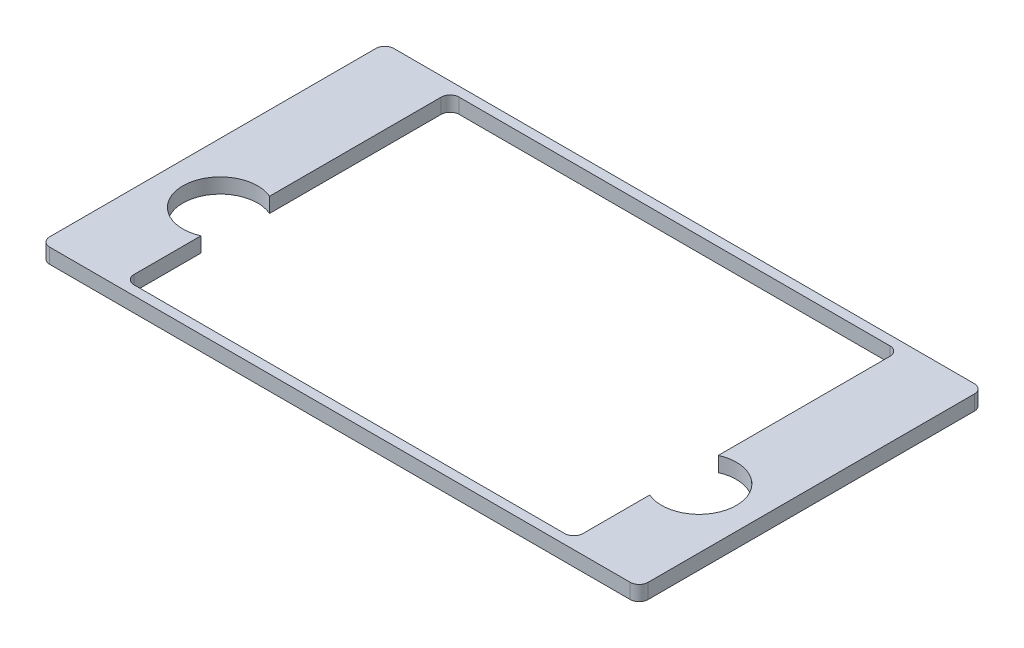
ISO-10303-21;
HEADER;
FILE_DESCRIPTION(('STEP AP214'),'2;1');
FILE_NAME('part.step','',(''),(''),'','','');
FILE_SCHEMA(('AUTOMOTIVE_DESIGN { 1 0 10303 214 1 1 1 1 }'));
ENDSEC;
DATA;
#1=APPLICATION_CONTEXT('core data for automotive mechanical design processes');
#2=APPLICATION_PROTOCOL_DEFINITION('international standard','automotive_design',2000,#1);
#3=PRODUCT_CONTEXT('',#1,'mechanical');
#4=PRODUCT('Part','Part','',(#3));
#5=PRODUCT_RELATED_PRODUCT_CATEGORY('part','',(#4));
#6=PRODUCT_DEFINITION_FORMATION('','',#4);
#7=PRODUCT_DEFINITION_CONTEXT('part definition',#1,'design');
#8=PRODUCT_DEFINITION('design','',#6,#7);
#9=PRODUCT_DEFINITION_SHAPE('','',#8);
#10=(LENGTH_UNIT() NAMED_UNIT(*) SI_UNIT(.MILLI.,.METRE.));
#11=(NAMED_UNIT(*) PLANE_ANGLE_UNIT() SI_UNIT($,.RADIAN.));
#12=(NAMED_UNIT(*) SI_UNIT($,.STERADIAN.) SOLID_ANGLE_UNIT());
#13=UNCERTAINTY_MEASURE_WITH_UNIT(LENGTH_MEASURE(1.E-05),#10,'distance_accuracy_value','');
#14=(GEOMETRIC_REPRESENTATION_CONTEXT(3) GLOBAL_UNCERTAINTY_ASSIGNED_CONTEXT((#13)) GLOBAL_UNIT_ASSIGNED_CONTEXT((#10,
#11,#12)) REPRESENTATION_CONTEXT('',''));
#15=CARTESIAN_POINT('',(0.,0.,0.));
#16=DIRECTION('',(0.,0.,1.));
#17=DIRECTION('',(1.,0.,0.));
#18=AXIS2_PLACEMENT_3D('',#15,#16,#17);
#19=CARTESIAN_POINT('',(222.25,6.35,-138.215));
#20=DIRECTION('',(-1.,0.,0.));
#21=DIRECTION('',(0.,0.,1.));
#22=AXIS2_PLACEMENT_3D('',#19,#20,#21);
#23=PLANE('',#22);
#24=DIRECTION('',(0.,1.,0.));
#25=VECTOR('',#24,1.);
#26=CARTESIAN_POINT('',(222.25,0.,-36.2503221685152));
#27=LINE('',#26,#25);
#28=CARTESIAN_POINT('',(222.25,0.,-36.2503221685152));
#29=VERTEX_POINT('',#28);
#30=CARTESIAN_POINT('',(222.25,6.35,-36.2503221685152));
#31=VERTEX_POINT('',#30);
#32=EDGE_CURVE('E11',#29,#31,#27,.T.);
#33=ORIENTED_EDGE('',*,*,#32,.F.);
#34=DIRECTION('',(0.,0.,-1.));
#35=VECTOR('',#34,1.);
#36=CARTESIAN_POINT('',(222.25,0.,-138.215));
#37=LINE('',#36,#35);
#38=CARTESIAN_POINT('',(222.25,0.,-7.835));
#39=VERTEX_POINT('',#38);
#40=EDGE_CURVE('E214',#39,#29,#37,.T.);
#41=ORIENTED_EDGE('',*,*,#40,.F.);
#42=DIRECTION('',(0.,-1.,0.));
#43=VECTOR('',#42,1.);
#44=CARTESIAN_POINT('',(222.25,6.35,-7.835));
#45=LINE('',#44,#43);
#46=CARTESIAN_POINT('',(222.25,6.35,-7.835));
#47=VERTEX_POINT('',#46);
#48=EDGE_CURVE('E238',#47,#39,#45,.T.);
#49=ORIENTED_EDGE('',*,*,#48,.F.);
#50=DIRECTION('',(0.,0.,-1.));
#51=VECTOR('',#50,1.);
#52=CARTESIAN_POINT('',(222.25,6.35,-138.215));
#53=LINE('',#52,#51);
#54=EDGE_CURVE('E348',#47,#31,#53,.T.);
#55=ORIENTED_EDGE('',*,*,#54,.T.);
#56=EDGE_LOOP('',(#33,#41,#49,#55));
#57=FACE_BOUND('',#56,.T.);
#58=ADVANCED_FACE('F38',(#57),#23,.T.);
#59=CARTESIAN_POINT('',(31.7500000000001,6.35,-138.215));
#60=DIRECTION('',(1.,0.,0.));
#61=DIRECTION('',(0.,0.,-1.));
#62=AXIS2_PLACEMENT_3D('',#59,#60,#61);
#63=PLANE('',#62);
#64=DIRECTION('',(0.,1.,0.));
#65=VECTOR('',#64,1.);
#66=CARTESIAN_POINT('',(31.7500000000001,0.,-65.3496778314848));
#67=LINE('',#66,#65);
#68=CARTESIAN_POINT('',(31.7500000000001,0.,-65.3496778314848));
#69=VERTEX_POINT('',#68);
#70=CARTESIAN_POINT('',(31.7500000000001,6.35,-65.3496778314848));
#71=VERTEX_POINT('',#70);
#72=EDGE_CURVE('E172',#69,#71,#67,.T.);
#73=ORIENTED_EDGE('',*,*,#72,.F.);
#74=DIRECTION('',(0.,0.,1.));
#75=VECTOR('',#74,1.);
#76=CARTESIAN_POINT('',(31.7500000000001,0.,-138.215));
#77=LINE('',#76,#75);
#78=CARTESIAN_POINT('',(31.7500000000001,0.,-138.215));
#79=VERTEX_POINT('',#78);
#80=EDGE_CURVE('E227',#79,#69,#77,.T.);
#81=ORIENTED_EDGE('',*,*,#80,.F.);
#82=DIRECTION('',(0.,-1.,0.));
#83=VECTOR('',#82,1.);
#84=CARTESIAN_POINT('',(31.7500000000001,6.35,-138.215));
#85=LINE('',#84,#83);
#86=CARTESIAN_POINT('',(31.7500000000001,6.35,-138.215));
#87=VERTEX_POINT('',#86);
#88=EDGE_CURVE('E194',#87,#79,#85,.T.);
#89=ORIENTED_EDGE('',*,*,#88,.F.);
#90=DIRECTION('',(0.,0.,1.));
#91=VECTOR('',#90,1.);
#92=CARTESIAN_POINT('',(31.7500000000001,6.35,-138.215));
#93=LINE('',#92,#91);
#94=EDGE_CURVE('E188',#87,#71,#93,.T.);
#95=ORIENTED_EDGE('',*,*,#94,.T.);
#96=EDGE_LOOP('',(#73,#81,#89,#95));
#97=FACE_BOUND('',#96,.T.);
#98=ADVANCED_FACE('F193',(#97),#63,.T.);
#99=CARTESIAN_POINT('',(250.19,6.35,-3.81));
#100=DIRECTION('',(0.,1.,0.));
#101=DIRECTION('',(0.,0.,1.));
#102=AXIS2_PLACEMENT_3D('',#99,#100,#101);
#103=PLANE('',#102);
#104=CARTESIAN_POINT('',(25.4,6.35,-50.8));
#105=DIRECTION('',(0.,1.,0.));
#106=DIRECTION('',(0.,0.,1.));
#107=AXIS2_PLACEMENT_3D('',#104,#105,#106);
#108=CIRCLE('',#107,15.875);
#109=CARTESIAN_POINT('',(31.7500000000001,6.35,-36.2503221685152));
#110=VERTEX_POINT('',#109);
#111=EDGE_CURVE('E60',#71,#110,#108,.T.);
#112=ORIENTED_EDGE('',*,*,#111,.F.);
#113=ORIENTED_EDGE('',*,*,#94,.F.);
#114=CARTESIAN_POINT('',(35.5600000000001,6.35,-138.215));
#115=DIRECTION('',(0.,1.,0.));
#116=DIRECTION('',(0.,0.,1.));
#117=AXIS2_PLACEMENT_3D('',#114,#115,#116);
#118=CIRCLE('',#117,3.81);
#119=CARTESIAN_POINT('',(35.5600000000001,6.35,-142.025));
#120=VERTEX_POINT('',#119);
#121=EDGE_CURVE('E200',#120,#87,#118,.T.);
#122=ORIENTED_EDGE('',*,*,#121,.F.);
#123=DIRECTION('',(-1.,0.,0.));
#124=VECTOR('',#123,1.);
#125=CARTESIAN_POINT('',(35.5600000000001,6.35,-142.025));
#126=LINE('',#125,#124);
#127=CARTESIAN_POINT('',(218.44,6.35,-142.025));
#128=VERTEX_POINT('',#127);
#129=EDGE_CURVE('E327',#128,#120,#126,.T.);
#130=ORIENTED_EDGE('',*,*,#129,.F.);
#131=CARTESIAN_POINT('',(218.44,6.35,-138.215));
#132=DIRECTION('',(0.,1.,0.));
#133=DIRECTION('',(0.,0.,-1.));
#134=AXIS2_PLACEMENT_3D('',#131,#132,#133);
#135=CIRCLE('',#134,3.81000000000001);
#136=CARTESIAN_POINT('',(222.25,6.35,-138.215));
#137=VERTEX_POINT('',#136);
#138=EDGE_CURVE('E351',#137,#128,#135,.T.);
#139=ORIENTED_EDGE('',*,*,#138,.F.);
#140=CARTESIAN_POINT('',(222.25,6.35,-65.3496778314848));
#141=VERTEX_POINT('',#140);
#142=EDGE_CURVE('E316',#141,#137,#53,.T.);
#143=ORIENTED_EDGE('',*,*,#142,.F.);
#144=CARTESIAN_POINT('',(228.6,6.35,-50.8));
#145=DIRECTION('',(0.,1.,0.));
#146=DIRECTION('',(0.,0.,1.));
#147=AXIS2_PLACEMENT_3D('',#144,#145,#146);
#148=CIRCLE('',#147,15.875);
#149=EDGE_CURVE('E52',#31,#141,#148,.T.);
#150=ORIENTED_EDGE('',*,*,#149,.F.);
#151=ORIENTED_EDGE('',*,*,#54,.F.);
#152=CARTESIAN_POINT('',(218.44,6.35,-7.835));
#153=DIRECTION('',(0.,1.,0.));
#154=DIRECTION('',(0.,0.,1.));
#155=AXIS2_PLACEMENT_3D('',#152,#153,#154);
#156=CIRCLE('',#155,3.81000000000002);
#157=CARTESIAN_POINT('',(218.44,6.35,-4.02499999999998));
#158=VERTEX_POINT('',#157);
#159=EDGE_CURVE('E343',#158,#47,#156,.T.);
#160=ORIENTED_EDGE('',*,*,#159,.F.);
#161=DIRECTION('',(1.,0.,0.));
#162=VECTOR('',#161,1.);
#163=CARTESIAN_POINT('',(35.5600000000001,6.35,-4.025));
#164=LINE('',#163,#162);
#165=CARTESIAN_POINT('',(35.5600000000001,6.35,-4.025));
#166=VERTEX_POINT('',#165);
#167=EDGE_CURVE('E341',#166,#158,#164,.T.);
#168=ORIENTED_EDGE('',*,*,#167,.F.);
#169=CARTESIAN_POINT('',(35.5600000000001,6.35,-7.835));
#170=DIRECTION('',(0.,1.,0.));
#171=DIRECTION('',(0.,0.,1.));
#172=AXIS2_PLACEMENT_3D('',#169,#170,#171);
#173=CIRCLE('',#172,3.81);
#174=CARTESIAN_POINT('',(31.7500000000001,6.35,-7.835));
#175=VERTEX_POINT('',#174);
#176=EDGE_CURVE('E228',#175,#166,#173,.T.);
#177=ORIENTED_EDGE('',*,*,#176,.F.);
#178=EDGE_CURVE('E190',#110,#175,#93,.T.);
#179=ORIENTED_EDGE('',*,*,#178,.F.);
#180=EDGE_LOOP('',(#112,#113,#122,#130,#139,#143,#150,#151,#160,#168,#177,#179));
#181=FACE_BOUND('',#180,.T.);
#182=CARTESIAN_POINT('',(250.19,6.35,-3.81));
#183=DIRECTION('',(0.,1.,0.));
#184=DIRECTION('',(0.,0.,1.));
#185=AXIS2_PLACEMENT_3D('',#182,#183,#184);
#186=CIRCLE('',#185,3.80999999999999);
#187=CARTESIAN_POINT('',(250.19,6.35,0.));
#188=VERTEX_POINT('',#187);
#189=CARTESIAN_POINT('',(254.,6.35,-3.81));
#190=VERTEX_POINT('',#189);
#191=EDGE_CURVE('E246',#188,#190,#186,.T.);
#192=ORIENTED_EDGE('',*,*,#191,.T.);
#193=DIRECTION('',(0.,0.,-1.));
#194=VECTOR('',#193,1.);
#195=CARTESIAN_POINT('',(254.,6.35,-3.81));
#196=LINE('',#195,#194);
#197=CARTESIAN_POINT('',(254.,6.35,-142.24));
#198=VERTEX_POINT('',#197);
#199=EDGE_CURVE('E249',#190,#198,#196,.T.);
#200=ORIENTED_EDGE('',*,*,#199,.T.);
#201=CARTESIAN_POINT('',(250.19,6.35,-142.24));
#202=DIRECTION('',(0.,1.,0.));
#203=DIRECTION('',(0.,0.,-1.));
#204=AXIS2_PLACEMENT_3D('',#201,#202,#203);
#205=CIRCLE('',#204,3.81000000000002);
#206=CARTESIAN_POINT('',(250.19,6.35,-146.05));
#207=VERTEX_POINT('',#206);
#208=EDGE_CURVE('E252',#198,#207,#205,.T.);
#209=ORIENTED_EDGE('',*,*,#208,.T.);
#210=DIRECTION('',(-1.,0.,0.));
#211=VECTOR('',#210,1.);
#212=CARTESIAN_POINT('',(3.81,6.35,-146.05));
#213=LINE('',#212,#211);
#214=CARTESIAN_POINT('',(3.81,6.35,-146.05));
#215=VERTEX_POINT('',#214);
#216=EDGE_CURVE('E254',#207,#215,#213,.T.);
#217=ORIENTED_EDGE('',*,*,#216,.T.);
#218=CARTESIAN_POINT('',(3.81,6.35,-142.24));
#219=DIRECTION('',(0.,1.,0.));
#220=DIRECTION('',(0.,0.,-1.));
#221=AXIS2_PLACEMENT_3D('',#218,#219,#220);
#222=CIRCLE('',#221,3.81);
#223=CARTESIAN_POINT('',(0.,6.35,-142.24));
#224=VERTEX_POINT('',#223);
#225=EDGE_CURVE('E256',#215,#224,#222,.T.);
#226=ORIENTED_EDGE('',*,*,#225,.T.);
#227=DIRECTION('',(0.,0.,1.));
#228=VECTOR('',#227,1.);
#229=CARTESIAN_POINT('',(0.,6.35,-3.81000000000003));
#230=LINE('',#229,#228);
#231=CARTESIAN_POINT('',(0.,6.35,-3.81000000000003));
#232=VERTEX_POINT('',#231);
#233=EDGE_CURVE('E258',#224,#232,#230,.T.);
#234=ORIENTED_EDGE('',*,*,#233,.T.);
#235=CARTESIAN_POINT('',(3.81,6.35,-3.81));
#236=DIRECTION('',(0.,1.,0.));
#237=DIRECTION('',(0.,0.,-1.));
#238=AXIS2_PLACEMENT_3D('',#235,#236,#237);
#239=CIRCLE('',#238,3.81);
#240=CARTESIAN_POINT('',(3.81000000000003,6.35,0.));
#241=VERTEX_POINT('',#240);
#242=EDGE_CURVE('E260',#232,#241,#239,.T.);
#243=ORIENTED_EDGE('',*,*,#242,.T.);
#244=DIRECTION('',(1.,0.,0.));
#245=VECTOR('',#244,1.);
#246=CARTESIAN_POINT('',(3.81000000000003,6.35,0.));
#247=LINE('',#246,#245);
#248=EDGE_CURVE('E262',#241,#188,#247,.T.);
#249=ORIENTED_EDGE('',*,*,#248,.T.);
#250=EDGE_LOOP('',(#192,#200,#209,#217,#226,#234,#243,#249));
#251=FACE_BOUND('',#250,.T.);
#252=ADVANCED_FACE('F185',(#181,#251),#103,.T.);
#253=CARTESIAN_POINT('',(250.19,0.,-3.81));
#254=DIRECTION('',(0.,1.,0.));
#255=DIRECTION('',(0.,0.,1.));
#256=AXIS2_PLACEMENT_3D('',#253,#254,#255);
#257=PLANE('',#256);
#258=CARTESIAN_POINT('',(250.19,0.,-3.81));
#259=DIRECTION('',(0.,1.,0.));
#260=DIRECTION('',(0.,0.,1.));
#261=AXIS2_PLACEMENT_3D('',#258,#259,#260);
#262=CIRCLE('',#261,3.80999999999999);
#263=CARTESIAN_POINT('',(250.19,0.,0.));
#264=VERTEX_POINT('',#263);
#265=CARTESIAN_POINT('',(254.,0.,-3.81));
#266=VERTEX_POINT('',#265);
#267=EDGE_CURVE('E245',#264,#266,#262,.T.);
#268=ORIENTED_EDGE('',*,*,#267,.F.);
#269=DIRECTION('',(1.,0.,0.));
#270=VECTOR('',#269,1.);
#271=CARTESIAN_POINT('',(3.81000000000003,0.,0.));
#272=LINE('',#271,#270);
#273=CARTESIAN_POINT('',(3.81000000000003,0.,0.));
#274=VERTEX_POINT('',#273);
#275=EDGE_CURVE('E250',#274,#264,#272,.T.);
#276=ORIENTED_EDGE('',*,*,#275,.F.);
#277=CARTESIAN_POINT('',(3.81,0.,-3.81));
#278=DIRECTION('',(0.,1.,0.));
#279=DIRECTION('',(0.,0.,-1.));
#280=AXIS2_PLACEMENT_3D('',#277,#278,#279);
#281=CIRCLE('',#280,3.81);
#282=CARTESIAN_POINT('',(0.,0.,-3.81000000000003));
#283=VERTEX_POINT('',#282);
#284=EDGE_CURVE('E277',#283,#274,#281,.T.);
#285=ORIENTED_EDGE('',*,*,#284,.F.);
#286=DIRECTION('',(0.,0.,1.));
#287=VECTOR('',#286,1.);
#288=CARTESIAN_POINT('',(0.,0.,-3.81000000000003));
#289=LINE('',#288,#287);
#290=CARTESIAN_POINT('',(0.,0.,-142.24));
#291=VERTEX_POINT('',#290);
#292=EDGE_CURVE('E275',#291,#283,#289,.T.);
#293=ORIENTED_EDGE('',*,*,#292,.F.);
#294=CARTESIAN_POINT('',(3.81,0.,-142.24));
#295=DIRECTION('',(0.,1.,0.));
#296=DIRECTION('',(0.,0.,-1.));
#297=AXIS2_PLACEMENT_3D('',#294,#295,#296);
#298=CIRCLE('',#297,3.81);
#299=CARTESIAN_POINT('',(3.81,0.,-146.05));
#300=VERTEX_POINT('',#299);
#301=EDGE_CURVE('E273',#300,#291,#298,.T.);
#302=ORIENTED_EDGE('',*,*,#301,.F.);
#303=DIRECTION('',(-1.,0.,0.));
#304=VECTOR('',#303,1.);
#305=CARTESIAN_POINT('',(3.81,0.,-146.05));
#306=LINE('',#305,#304);
#307=CARTESIAN_POINT('',(250.19,0.,-146.05));
#308=VERTEX_POINT('',#307);
#309=EDGE_CURVE('E271',#308,#300,#306,.T.);
#310=ORIENTED_EDGE('',*,*,#309,.F.);
#311=CARTESIAN_POINT('',(250.19,0.,-142.24));
#312=DIRECTION('',(0.,1.,0.));
#313=DIRECTION('',(0.,0.,-1.));
#314=AXIS2_PLACEMENT_3D('',#311,#312,#313);
#315=CIRCLE('',#314,3.81000000000002);
#316=CARTESIAN_POINT('',(254.,0.,-142.24));
#317=VERTEX_POINT('',#316);
#318=EDGE_CURVE('E269',#317,#308,#315,.T.);
#319=ORIENTED_EDGE('',*,*,#318,.F.);
#320=DIRECTION('',(0.,0.,-1.));
#321=VECTOR('',#320,1.);
#322=CARTESIAN_POINT('',(254.,0.,-3.81));
#323=LINE('',#322,#321);
#324=EDGE_CURVE('E267',#266,#317,#323,.T.);
#325=ORIENTED_EDGE('',*,*,#324,.F.);
#326=EDGE_LOOP('',(#268,#276,#285,#293,#302,#310,#319,#325));
#327=FACE_BOUND('',#326,.T.);
#328=ORIENTED_EDGE('',*,*,#80,.T.);
#329=CARTESIAN_POINT('',(25.4,0.,-50.8));
#330=DIRECTION('',(0.,1.,0.));
#331=DIRECTION('',(0.,0.,1.));
#332=AXIS2_PLACEMENT_3D('',#329,#330,#331);
#333=CIRCLE('',#332,15.875);
#334=CARTESIAN_POINT('',(31.7500000000001,0.,-36.2503221685152));
#335=VERTEX_POINT('',#334);
#336=EDGE_CURVE('E175',#69,#335,#333,.T.);
#337=ORIENTED_EDGE('',*,*,#336,.T.);
#338=CARTESIAN_POINT('',(31.7500000000001,0.,-7.835));
#339=VERTEX_POINT('',#338);
#340=EDGE_CURVE('E226',#335,#339,#77,.T.);
#341=ORIENTED_EDGE('',*,*,#340,.T.);
#342=CARTESIAN_POINT('',(35.5600000000001,0.,-7.835));
#343=DIRECTION('',(0.,1.,0.));
#344=DIRECTION('',(0.,0.,1.));
#345=AXIS2_PLACEMENT_3D('',#342,#343,#344);
#346=CIRCLE('',#345,3.81);
#347=CARTESIAN_POINT('',(35.5600000000001,0.,-4.025));
#348=VERTEX_POINT('',#347);
#349=EDGE_CURVE('E204',#339,#348,#346,.T.);
#350=ORIENTED_EDGE('',*,*,#349,.T.);
#351=DIRECTION('',(1.,0.,0.));
#352=VECTOR('',#351,1.);
#353=CARTESIAN_POINT('',(35.5600000000001,0.,-4.025));
#354=LINE('',#353,#352);
#355=CARTESIAN_POINT('',(218.44,0.,-4.02499999999998));
#356=VERTEX_POINT('',#355);
#357=EDGE_CURVE('E207',#348,#356,#354,.T.);
#358=ORIENTED_EDGE('',*,*,#357,.T.);
#359=CARTESIAN_POINT('',(218.44,0.,-7.835));
#360=DIRECTION('',(0.,1.,0.));
#361=DIRECTION('',(0.,0.,1.));
#362=AXIS2_PLACEMENT_3D('',#359,#360,#361);
#363=CIRCLE('',#362,3.81000000000002);
#364=EDGE_CURVE('E210',#356,#39,#363,.T.);
#365=ORIENTED_EDGE('',*,*,#364,.T.);
#366=ORIENTED_EDGE('',*,*,#40,.T.);
#367=CARTESIAN_POINT('',(228.6,0.,-50.8));
#368=DIRECTION('',(0.,1.,0.));
#369=DIRECTION('',(0.,0.,1.));
#370=AXIS2_PLACEMENT_3D('',#367,#368,#369);
#371=CIRCLE('',#370,15.875);
#372=CARTESIAN_POINT('',(222.25,0.,-65.3496778314848));
#373=VERTEX_POINT('',#372);
#374=EDGE_CURVE('E191',#29,#373,#371,.T.);
#375=ORIENTED_EDGE('',*,*,#374,.T.);
#376=CARTESIAN_POINT('',(222.25,0.,-138.215));
#377=VERTEX_POINT('',#376);
#378=EDGE_CURVE('E213',#373,#377,#37,.T.);
#379=ORIENTED_EDGE('',*,*,#378,.T.);
#380=CARTESIAN_POINT('',(218.44,0.,-138.215));
#381=DIRECTION('',(0.,1.,0.));
#382=DIRECTION('',(0.,0.,-1.));
#383=AXIS2_PLACEMENT_3D('',#380,#381,#382);
#384=CIRCLE('',#383,3.81000000000001);
#385=CARTESIAN_POINT('',(218.44,0.,-142.025));
#386=VERTEX_POINT('',#385);
#387=EDGE_CURVE('E217',#377,#386,#384,.T.);
#388=ORIENTED_EDGE('',*,*,#387,.T.);
#389=DIRECTION('',(-1.,0.,0.));
#390=VECTOR('',#389,1.);
#391=CARTESIAN_POINT('',(35.5600000000001,0.,-142.025));
#392=LINE('',#391,#390);
#393=CARTESIAN_POINT('',(35.5600000000001,0.,-142.025));
#394=VERTEX_POINT('',#393);
#395=EDGE_CURVE('E220',#386,#394,#392,.T.);
#396=ORIENTED_EDGE('',*,*,#395,.T.);
#397=CARTESIAN_POINT('',(35.5600000000001,0.,-138.215));
#398=DIRECTION('',(0.,1.,0.));
#399=DIRECTION('',(0.,0.,1.));
#400=AXIS2_PLACEMENT_3D('',#397,#398,#399);
#401=CIRCLE('',#400,3.81);
#402=EDGE_CURVE('E223',#394,#79,#401,.T.);
#403=ORIENTED_EDGE('',*,*,#402,.T.);
#404=EDGE_LOOP('',(#328,#337,#341,#350,#358,#365,#366,#375,#379,#388,#396,#403));
#405=FACE_BOUND('',#404,.T.);
#406=ADVANCED_FACE('F310',(#327,#405),#257,.F.);
#407=CARTESIAN_POINT('',(250.19,6.35,-3.81));
#408=DIRECTION('',(0.,-1.,0.));
#409=DIRECTION('',(0.,0.,-1.));
#410=AXIS2_PLACEMENT_3D('',#407,#408,#409);
#411=CYLINDRICAL_SURFACE('',#410,3.80999999999999);
#412=ORIENTED_EDGE('',*,*,#267,.T.);
#413=DIRECTION('',(0.,-1.,0.));
#414=VECTOR('',#413,1.);
#415=CARTESIAN_POINT('',(254.,6.35,-3.81));
#416=LINE('',#415,#414);
#417=EDGE_CURVE('E300',#190,#266,#416,.T.);
#418=ORIENTED_EDGE('',*,*,#417,.F.);
#419=ORIENTED_EDGE('',*,*,#191,.F.);
#420=DIRECTION('',(0.,-1.,0.));
#421=VECTOR('',#420,1.);
#422=CARTESIAN_POINT('',(250.19,6.35,0.));
#423=LINE('',#422,#421);
#424=EDGE_CURVE('E264',#188,#264,#423,.T.);
#425=ORIENTED_EDGE('',*,*,#424,.T.);
#426=EDGE_LOOP('',(#412,#418,#419,#425));
#427=FACE_BOUND('',#426,.T.);
#428=ADVANCED_FACE('F40',(#427),#411,.T.);
#429=CARTESIAN_POINT('',(254.,6.35,-3.81));
#430=DIRECTION('',(-1.,0.,0.));
#431=DIRECTION('',(0.,0.,1.));
#432=AXIS2_PLACEMENT_3D('',#429,#430,#431);
#433=PLANE('',#432);
#434=ORIENTED_EDGE('',*,*,#324,.T.);
#435=DIRECTION('',(0.,-1.,0.));
#436=VECTOR('',#435,1.);
#437=CARTESIAN_POINT('',(254.,6.35,-142.24));
#438=LINE('',#437,#436);
#439=EDGE_CURVE('E297',#198,#317,#438,.T.);
#440=ORIENTED_EDGE('',*,*,#439,.F.);
#441=ORIENTED_EDGE('',*,*,#199,.F.);
#442=ORIENTED_EDGE('',*,*,#417,.T.);
#443=EDGE_LOOP('',(#434,#440,#441,#442));
#444=FACE_BOUND('',#443,.T.);
#445=ADVANCED_FACE('F504',(#444),#433,.F.);
#446=CARTESIAN_POINT('',(250.19,6.35,-142.24));
#447=DIRECTION('',(0.,-1.,0.));
#448=DIRECTION('',(0.,0.,-1.));
#449=AXIS2_PLACEMENT_3D('',#446,#447,#448);
#450=CYLINDRICAL_SURFACE('',#449,3.81000000000002);
#451=ORIENTED_EDGE('',*,*,#318,.T.);
#452=DIRECTION('',(0.,-1.,0.));
#453=VECTOR('',#452,1.);
#454=CARTESIAN_POINT('',(250.19,6.35,-146.05));
#455=LINE('',#454,#453);
#456=EDGE_CURVE('E294',#207,#308,#455,.T.);
#457=ORIENTED_EDGE('',*,*,#456,.F.);
#458=ORIENTED_EDGE('',*,*,#208,.F.);
#459=ORIENTED_EDGE('',*,*,#439,.T.);
#460=EDGE_LOOP('',(#451,#457,#458,#459));
#461=FACE_BOUND('',#460,.T.);
#462=ADVANCED_FACE('F495',(#461),#450,.T.);
#463=CARTESIAN_POINT('',(3.81,6.35,-146.05));
#464=DIRECTION('',(0.,0.,1.));
#465=DIRECTION('',(1.,0.,0.));
#466=AXIS2_PLACEMENT_3D('',#463,#464,#465);
#467=PLANE('',#466);
#468=ORIENTED_EDGE('',*,*,#309,.T.);
#469=DIRECTION('',(0.,-1.,0.));
#470=VECTOR('',#469,1.);
#471=CARTESIAN_POINT('',(3.81,6.35,-146.05));
#472=LINE('',#471,#470);
#473=EDGE_CURVE('E291',#215,#300,#472,.T.);
#474=ORIENTED_EDGE('',*,*,#473,.F.);
#475=ORIENTED_EDGE('',*,*,#216,.F.);
#476=ORIENTED_EDGE('',*,*,#456,.T.);
#477=EDGE_LOOP('',(#468,#474,#475,#476));
#478=FACE_BOUND('',#477,.T.);
#479=ADVANCED_FACE('F486',(#478),#467,.F.);
#480=CARTESIAN_POINT('',(3.81,6.35,-142.24));
#481=DIRECTION('',(0.,-1.,0.));
#482=DIRECTION('',(0.,0.,-1.));
#483=AXIS2_PLACEMENT_3D('',#480,#481,#482);
#484=CYLINDRICAL_SURFACE('',#483,3.81);
#485=ORIENTED_EDGE('',*,*,#301,.T.);
#486=DIRECTION('',(0.,-1.,0.));
#487=VECTOR('',#486,1.);
#488=CARTESIAN_POINT('',(0.,6.35,-142.24));
#489=LINE('',#488,#487);
#490=EDGE_CURVE('E288',#224,#291,#489,.T.);
#491=ORIENTED_EDGE('',*,*,#490,.F.);
#492=ORIENTED_EDGE('',*,*,#225,.F.);
#493=ORIENTED_EDGE('',*,*,#473,.T.);
#494=EDGE_LOOP('',(#485,#491,#492,#493));
#495=FACE_BOUND('',#494,.T.);
#496=ADVANCED_FACE('F477',(#495),#484,.T.);
#497=CARTESIAN_POINT('',(0.,6.35,-3.81000000000003));
#498=DIRECTION('',(1.,0.,0.));
#499=DIRECTION('',(0.,0.,-1.));
#500=AXIS2_PLACEMENT_3D('',#497,#498,#499);
#501=PLANE('',#500);
#502=ORIENTED_EDGE('',*,*,#292,.T.);
#503=DIRECTION('',(0.,-1.,0.));
#504=VECTOR('',#503,1.);
#505=CARTESIAN_POINT('',(0.,6.35,-3.81000000000003));
#506=LINE('',#505,#504);
#507=EDGE_CURVE('E285',#232,#283,#506,.T.);
#508=ORIENTED_EDGE('',*,*,#507,.F.);
#509=ORIENTED_EDGE('',*,*,#233,.F.);
#510=ORIENTED_EDGE('',*,*,#490,.T.);
#511=EDGE_LOOP('',(#502,#508,#509,#510));
#512=FACE_BOUND('',#511,.T.);
#513=ADVANCED_FACE('F468',(#512),#501,.F.);
#514=CARTESIAN_POINT('',(3.81,6.35,-3.81));
#515=DIRECTION('',(0.,-1.,0.));
#516=DIRECTION('',(0.,0.,-1.));
#517=AXIS2_PLACEMENT_3D('',#514,#515,#516);
#518=CYLINDRICAL_SURFACE('',#517,3.81);
#519=ORIENTED_EDGE('',*,*,#284,.T.);
#520=DIRECTION('',(0.,-1.,0.));
#521=VECTOR('',#520,1.);
#522=CARTESIAN_POINT('',(3.81000000000003,6.35,0.));
#523=LINE('',#522,#521);
#524=EDGE_CURVE('E282',#241,#274,#523,.T.);
#525=ORIENTED_EDGE('',*,*,#524,.F.);
#526=ORIENTED_EDGE('',*,*,#242,.F.);
#527=ORIENTED_EDGE('',*,*,#507,.T.);
#528=EDGE_LOOP('',(#519,#525,#526,#527));
#529=FACE_BOUND('',#528,.T.);
#530=ADVANCED_FACE('F459',(#529),#518,.T.);
#531=CARTESIAN_POINT('',(3.81000000000003,6.35,0.));
#532=DIRECTION('',(0.,0.,-1.));
#533=DIRECTION('',(-1.,0.,0.));
#534=AXIS2_PLACEMENT_3D('',#531,#532,#533);
#535=PLANE('',#534);
#536=ORIENTED_EDGE('',*,*,#275,.T.);
#537=ORIENTED_EDGE('',*,*,#424,.F.);
#538=ORIENTED_EDGE('',*,*,#248,.F.);
#539=ORIENTED_EDGE('',*,*,#524,.T.);
#540=EDGE_LOOP('',(#536,#537,#538,#539));
#541=FACE_BOUND('',#540,.T.);
#542=ADVANCED_FACE('F368',(#541),#535,.F.);
#543=CARTESIAN_POINT('',(35.5600000000001,6.35,-7.835));
#544=DIRECTION('',(0.,-1.,0.));
#545=DIRECTION('',(0.,0.,-1.));
#546=AXIS2_PLACEMENT_3D('',#543,#544,#545);
#547=CYLINDRICAL_SURFACE('',#546,3.81);
#548=ORIENTED_EDGE('',*,*,#349,.F.);
#549=DIRECTION('',(0.,-1.,0.));
#550=VECTOR('',#549,1.);
#551=CARTESIAN_POINT('',(31.7500000000001,6.35,-7.835));
#552=LINE('',#551,#550);
#553=EDGE_CURVE('E196',#175,#339,#552,.T.);
#554=ORIENTED_EDGE('',*,*,#553,.F.);
#555=ORIENTED_EDGE('',*,*,#176,.T.);
#556=DIRECTION('',(0.,-1.,0.));
#557=VECTOR('',#556,1.);
#558=CARTESIAN_POINT('',(35.5600000000001,6.35,-4.025));
#559=LINE('',#558,#557);
#560=EDGE_CURVE('E242',#166,#348,#559,.T.);
#561=ORIENTED_EDGE('',*,*,#560,.T.);
#562=EDGE_LOOP('',(#548,#554,#555,#561));
#563=FACE_BOUND('',#562,.T.);
#564=ADVANCED_FACE('F337',(#563),#547,.F.);
#565=CARTESIAN_POINT('',(35.5600000000001,6.35,-4.025));
#566=DIRECTION('',(0.,0.,-1.));
#567=DIRECTION('',(-1.,0.,0.));
#568=AXIS2_PLACEMENT_3D('',#565,#566,#567);
#569=PLANE('',#568);
#570=ORIENTED_EDGE('',*,*,#357,.F.);
#571=ORIENTED_EDGE('',*,*,#560,.F.);
#572=ORIENTED_EDGE('',*,*,#167,.T.);
#573=DIRECTION('',(0.,-1.,0.));
#574=VECTOR('',#573,1.);
#575=CARTESIAN_POINT('',(218.44,6.35,-4.02499999999998));
#576=LINE('',#575,#574);
#577=EDGE_CURVE('E240',#158,#356,#576,.T.);
#578=ORIENTED_EDGE('',*,*,#577,.T.);
#579=EDGE_LOOP('',(#570,#571,#572,#578));
#580=FACE_BOUND('',#579,.T.);
#581=ADVANCED_FACE('F360',(#580),#569,.T.);
#582=CARTESIAN_POINT('',(218.44,6.35,-7.835));
#583=DIRECTION('',(0.,-1.,0.));
#584=DIRECTION('',(0.,0.,-1.));
#585=AXIS2_PLACEMENT_3D('',#582,#583,#584);
#586=CYLINDRICAL_SURFACE('',#585,3.81000000000002);
#587=ORIENTED_EDGE('',*,*,#364,.F.);
#588=ORIENTED_EDGE('',*,*,#577,.F.);
#589=ORIENTED_EDGE('',*,*,#159,.T.);
#590=ORIENTED_EDGE('',*,*,#48,.T.);
#591=EDGE_LOOP('',(#587,#588,#589,#590));
#592=FACE_BOUND('',#591,.T.);
#593=ADVANCED_FACE('F357',(#592),#586,.F.);
#594=DIRECTION('',(0.,1.,0.));
#595=VECTOR('',#594,1.);
#596=CARTESIAN_POINT('',(222.25,0.,-65.3496778314848));
#597=LINE('',#596,#595);
#598=EDGE_CURVE('E46',#141,#373,#597,.F.);
#599=ORIENTED_EDGE('',*,*,#598,.F.);
#600=ORIENTED_EDGE('',*,*,#142,.T.);
#601=DIRECTION('',(0.,-1.,0.));
#602=VECTOR('',#601,1.);
#603=CARTESIAN_POINT('',(222.25,6.35,-138.215));
#604=LINE('',#603,#602);
#605=EDGE_CURVE('E235',#137,#377,#604,.T.);
#606=ORIENTED_EDGE('',*,*,#605,.T.);
#607=ORIENTED_EDGE('',*,*,#378,.F.);
#608=EDGE_LOOP('',(#599,#600,#606,#607));
#609=FACE_BOUND('',#608,.T.);
#610=ADVANCED_FACE('F313',(#609),#23,.T.);
#611=CARTESIAN_POINT('',(218.44,6.35,-138.215));
#612=DIRECTION('',(0.,-1.,0.));
#613=DIRECTION('',(0.,0.,-1.));
#614=AXIS2_PLACEMENT_3D('',#611,#612,#613);
#615=CYLINDRICAL_SURFACE('',#614,3.81000000000001);
#616=ORIENTED_EDGE('',*,*,#387,.F.);
#617=ORIENTED_EDGE('',*,*,#605,.F.);
#618=ORIENTED_EDGE('',*,*,#138,.T.);
#619=DIRECTION('',(0.,-1.,0.));
#620=VECTOR('',#619,1.);
#621=CARTESIAN_POINT('',(218.44,6.35,-142.025));
#622=LINE('',#621,#620);
#623=EDGE_CURVE('E233',#128,#386,#622,.T.);
#624=ORIENTED_EDGE('',*,*,#623,.T.);
#625=EDGE_LOOP('',(#616,#617,#618,#624));
#626=FACE_BOUND('',#625,.T.);
#627=ADVANCED_FACE('F319',(#626),#615,.F.);
#628=CARTESIAN_POINT('',(35.5600000000001,6.35,-142.025));
#629=DIRECTION('',(0.,0.,1.));
#630=DIRECTION('',(1.,0.,0.));
#631=AXIS2_PLACEMENT_3D('',#628,#629,#630);
#632=PLANE('',#631);
#633=ORIENTED_EDGE('',*,*,#395,.F.);
#634=ORIENTED_EDGE('',*,*,#623,.F.);
#635=ORIENTED_EDGE('',*,*,#129,.T.);
#636=DIRECTION('',(0.,-1.,0.));
#637=VECTOR('',#636,1.);
#638=CARTESIAN_POINT('',(35.5600000000001,6.35,-142.025));
#639=LINE('',#638,#637);
#640=EDGE_CURVE('E231',#120,#394,#639,.T.);
#641=ORIENTED_EDGE('',*,*,#640,.T.);
#642=EDGE_LOOP('',(#633,#634,#635,#641));
#643=FACE_BOUND('',#642,.T.);
#644=ADVANCED_FACE('F324',(#643),#632,.T.);
#645=CARTESIAN_POINT('',(35.5600000000001,6.35,-138.215));
#646=DIRECTION('',(0.,-1.,0.));
#647=DIRECTION('',(0.,0.,-1.));
#648=AXIS2_PLACEMENT_3D('',#645,#646,#647);
#649=CYLINDRICAL_SURFACE('',#648,3.81);
#650=ORIENTED_EDGE('',*,*,#402,.F.);
#651=ORIENTED_EDGE('',*,*,#640,.F.);
#652=ORIENTED_EDGE('',*,*,#121,.T.);
#653=ORIENTED_EDGE('',*,*,#88,.T.);
#654=EDGE_LOOP('',(#650,#651,#652,#653));
#655=FACE_BOUND('',#654,.T.);
#656=ADVANCED_FACE('F329',(#655),#649,.F.);
#657=DIRECTION('',(0.,1.,0.));
#658=VECTOR('',#657,1.);
#659=CARTESIAN_POINT('',(31.7500000000001,0.,-36.2503221685152));
#660=LINE('',#659,#658);
#661=EDGE_CURVE('E180',#110,#335,#660,.F.);
#662=ORIENTED_EDGE('',*,*,#661,.F.);
#663=ORIENTED_EDGE('',*,*,#178,.T.);
#664=ORIENTED_EDGE('',*,*,#553,.T.);
#665=ORIENTED_EDGE('',*,*,#340,.F.);
#666=EDGE_LOOP('',(#662,#663,#664,#665));
#667=FACE_BOUND('',#666,.T.);
#668=ADVANCED_FACE('F334',(#667),#63,.T.);
#669=CARTESIAN_POINT('',(25.4,0.,-50.8));
#670=DIRECTION('',(0.,1.,0.));
#671=DIRECTION('',(0.,0.,1.));
#672=AXIS2_PLACEMENT_3D('',#669,#670,#671);
#673=CYLINDRICAL_SURFACE('',#672,15.875);
#674=ORIENTED_EDGE('',*,*,#72,.T.);
#675=ORIENTED_EDGE('',*,*,#111,.T.);
#676=ORIENTED_EDGE('',*,*,#661,.T.);
#677=ORIENTED_EDGE('',*,*,#336,.F.);
#678=EDGE_LOOP('',(#674,#675,#676,#677));
#679=FACE_BOUND('',#678,.T.);
#680=ADVANCED_FACE('F173',(#679),#673,.F.);
#681=CARTESIAN_POINT('',(228.6,0.,-50.8));
#682=DIRECTION('',(0.,1.,0.));
#683=DIRECTION('',(0.,0.,1.));
#684=AXIS2_PLACEMENT_3D('',#681,#682,#683);
#685=CYLINDRICAL_SURFACE('',#684,15.875);
#686=ORIENTED_EDGE('',*,*,#32,.T.);
#687=ORIENTED_EDGE('',*,*,#149,.T.);
#688=ORIENTED_EDGE('',*,*,#598,.T.);
#689=ORIENTED_EDGE('',*,*,#374,.F.);
#690=EDGE_LOOP('',(#686,#687,#688,#689));
#691=FACE_BOUND('',#690,.T.);
#692=ADVANCED_FACE('F304',(#691),#685,.F.);
#693=CLOSED_SHELL('',(#58,#98,#252,#406,#428,#445,#462,#479,#496,#513,#530,#542,#564,#581,#593,
#610,#627,#644,#656,#668,#680,#692));
#694=MANIFOLD_SOLID_BREP('B2',#693);
#695=ADVANCED_BREP_SHAPE_REPRESENTATION('',(#18,#694),#14);
#696=SHAPE_DEFINITION_REPRESENTATION(#9,#695);
ENDSEC;
END-ISO-10303-21;
